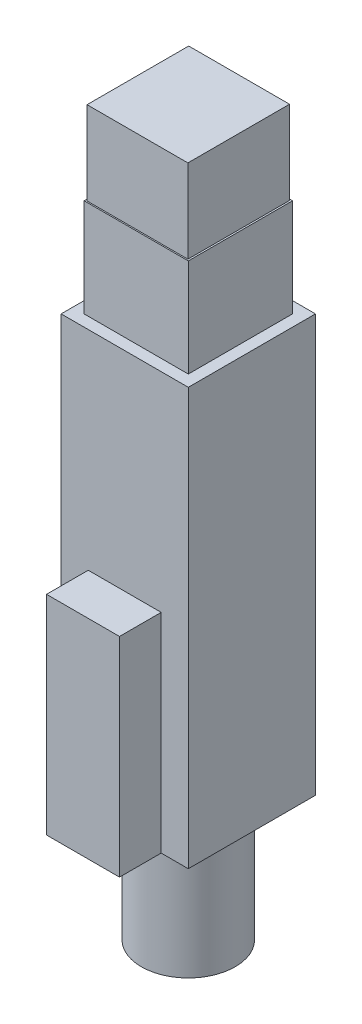
ISO-10303-21;
HEADER;
FILE_DESCRIPTION(('STEP AP214'),'2;1');
FILE_NAME('part.step','',(''),(''),'','','');
FILE_SCHEMA(('AUTOMOTIVE_DESIGN { 1 0 10303 214 1 1 1 1 }'));
ENDSEC;
DATA;
#1=APPLICATION_CONTEXT('core data for automotive mechanical design processes');
#2=APPLICATION_PROTOCOL_DEFINITION('international standard','automotive_design',2000,#1);
#3=PRODUCT_CONTEXT('',#1,'mechanical');
#4=PRODUCT('Part','Part','',(#3));
#5=PRODUCT_RELATED_PRODUCT_CATEGORY('part','',(#4));
#6=PRODUCT_DEFINITION_FORMATION('','',#4);
#7=PRODUCT_DEFINITION_CONTEXT('part definition',#1,'design');
#8=PRODUCT_DEFINITION('design','',#6,#7);
#9=PRODUCT_DEFINITION_SHAPE('','',#8);
#10=(LENGTH_UNIT() NAMED_UNIT(*) SI_UNIT(.MILLI.,.METRE.));
#11=(NAMED_UNIT(*) PLANE_ANGLE_UNIT() SI_UNIT($,.RADIAN.));
#12=(NAMED_UNIT(*) SI_UNIT($,.STERADIAN.) SOLID_ANGLE_UNIT());
#13=UNCERTAINTY_MEASURE_WITH_UNIT(LENGTH_MEASURE(1.E-05),#10,'distance_accuracy_value','');
#14=(GEOMETRIC_REPRESENTATION_CONTEXT(3) GLOBAL_UNCERTAINTY_ASSIGNED_CONTEXT((#13)) GLOBAL_UNIT_ASSIGNED_CONTEXT((#10,
#11,#12)) REPRESENTATION_CONTEXT('',''));
#15=CARTESIAN_POINT('',(0.,0.,0.));
#16=DIRECTION('',(0.,0.,1.));
#17=DIRECTION('',(1.,0.,0.));
#18=AXIS2_PLACEMENT_3D('',#15,#16,#17);
#19=CARTESIAN_POINT('',(-3.05,26.,3.05));
#20=DIRECTION('',(0.,0.,-1.));
#21=DIRECTION('',(-1.,0.,0.));
#22=AXIS2_PLACEMENT_3D('',#19,#20,#21);
#23=PLANE('',#22);
#24=DIRECTION('',(0.,-1.,0.));
#25=VECTOR('',#24,1.);
#26=CARTESIAN_POINT('',(-1.75,6.,3.05));
#27=LINE('',#26,#25);
#28=CARTESIAN_POINT('',(-1.75,16.,3.05));
#29=VERTEX_POINT('',#28);
#30=CARTESIAN_POINT('',(-1.75,6.,3.05));
#31=VERTEX_POINT('',#30);
#32=EDGE_CURVE('E38',#29,#31,#27,.T.);
#33=ORIENTED_EDGE('',*,*,#32,.F.);
#34=DIRECTION('',(-1.,0.,0.));
#35=VECTOR('',#34,1.);
#36=CARTESIAN_POINT('',(-1.75,16.,3.05));
#37=LINE('',#36,#35);
#38=CARTESIAN_POINT('',(1.75,16.,3.05));
#39=VERTEX_POINT('',#38);
#40=EDGE_CURVE('E169',#39,#29,#37,.T.);
#41=ORIENTED_EDGE('',*,*,#40,.F.);
#42=DIRECTION('',(0.,1.,0.));
#43=VECTOR('',#42,1.);
#44=CARTESIAN_POINT('',(1.75,6.,3.05));
#45=LINE('',#44,#43);
#46=CARTESIAN_POINT('',(1.75,6.,3.05));
#47=VERTEX_POINT('',#46);
#48=EDGE_CURVE('E57',#47,#39,#45,.T.);
#49=ORIENTED_EDGE('',*,*,#48,.F.);
#50=DIRECTION('',(1.,0.,0.));
#51=VECTOR('',#50,1.);
#52=CARTESIAN_POINT('',(-3.05,6.,3.05));
#53=LINE('',#52,#51);
#54=CARTESIAN_POINT('',(3.05,6.,3.05));
#55=VERTEX_POINT('',#54);
#56=EDGE_CURVE('E186',#47,#55,#53,.T.);
#57=ORIENTED_EDGE('',*,*,#56,.T.);
#58=DIRECTION('',(0.,-1.,0.));
#59=VECTOR('',#58,1.);
#60=CARTESIAN_POINT('',(3.05,26.,3.05));
#61=LINE('',#60,#59);
#62=CARTESIAN_POINT('',(3.05,26.,3.05));
#63=VERTEX_POINT('',#62);
#64=EDGE_CURVE('E195',#63,#55,#61,.T.);
#65=ORIENTED_EDGE('',*,*,#64,.F.);
#66=DIRECTION('',(1.,0.,0.));
#67=VECTOR('',#66,1.);
#68=CARTESIAN_POINT('',(-3.05,26.,3.05));
#69=LINE('',#68,#67);
#70=CARTESIAN_POINT('',(-3.05,26.,3.05));
#71=VERTEX_POINT('',#70);
#72=EDGE_CURVE('E200',#71,#63,#69,.T.);
#73=ORIENTED_EDGE('',*,*,#72,.F.);
#74=DIRECTION('',(0.,-1.,0.));
#75=VECTOR('',#74,1.);
#76=CARTESIAN_POINT('',(-3.05,26.,3.05));
#77=LINE('',#76,#75);
#78=CARTESIAN_POINT('',(-3.05,6.,3.05));
#79=VERTEX_POINT('',#78);
#80=EDGE_CURVE('E199',#71,#79,#77,.T.);
#81=ORIENTED_EDGE('',*,*,#80,.T.);
#82=EDGE_CURVE('E189',#79,#31,#53,.T.);
#83=ORIENTED_EDGE('',*,*,#82,.T.);
#84=EDGE_LOOP('',(#33,#41,#49,#57,#65,#73,#81,#83));
#85=FACE_BOUND('',#84,.T.);
#86=ADVANCED_FACE('F34',(#85),#23,.F.);
#87=CARTESIAN_POINT('',(2.5,34.7,2.5));
#88=DIRECTION('',(-1.,0.,0.));
#89=DIRECTION('',(0.,0.,1.));
#90=AXIS2_PLACEMENT_3D('',#87,#88,#89);
#91=PLANE('',#90);
#92=DIRECTION('',(0.,0.,-1.));
#93=VECTOR('',#92,1.);
#94=CARTESIAN_POINT('',(2.5,30.7,2.5));
#95=LINE('',#94,#93);
#96=CARTESIAN_POINT('',(2.5,30.7,2.5));
#97=VERTEX_POINT('',#96);
#98=CARTESIAN_POINT('',(2.5,30.7,-2.5));
#99=VERTEX_POINT('',#98);
#100=EDGE_CURVE('E286',#97,#99,#95,.T.);
#101=ORIENTED_EDGE('',*,*,#100,.F.);
#102=DIRECTION('',(0.,-1.,0.));
#103=VECTOR('',#102,1.);
#104=CARTESIAN_POINT('',(2.5,34.7,2.5));
#105=LINE('',#104,#103);
#106=CARTESIAN_POINT('',(2.5,26.,2.5));
#107=VERTEX_POINT('',#106);
#108=EDGE_CURVE('E272',#97,#107,#105,.T.);
#109=ORIENTED_EDGE('',*,*,#108,.T.);
#110=DIRECTION('',(0.,0.,-1.));
#111=VECTOR('',#110,1.);
#112=CARTESIAN_POINT('',(2.5,26.,2.5));
#113=LINE('',#112,#111);
#114=CARTESIAN_POINT('',(2.5,26.,-2.5));
#115=VERTEX_POINT('',#114);
#116=EDGE_CURVE('E283',#107,#115,#113,.T.);
#117=ORIENTED_EDGE('',*,*,#116,.T.);
#118=DIRECTION('',(0.,-1.,0.));
#119=VECTOR('',#118,1.);
#120=CARTESIAN_POINT('',(2.5,34.7,-2.5));
#121=LINE('',#120,#119);
#122=EDGE_CURVE('E256',#99,#115,#121,.T.);
#123=ORIENTED_EDGE('',*,*,#122,.F.);
#124=EDGE_LOOP('',(#101,#109,#117,#123));
#125=FACE_BOUND('',#124,.T.);
#126=ADVANCED_FACE('F228',(#125),#91,.F.);
#127=CARTESIAN_POINT('',(-2.5,34.7,-2.5));
#128=DIRECTION('',(0.,0.,1.));
#129=DIRECTION('',(1.,0.,0.));
#130=AXIS2_PLACEMENT_3D('',#127,#128,#129);
#131=PLANE('',#130);
#132=DIRECTION('',(-1.,0.,0.));
#133=VECTOR('',#132,1.);
#134=CARTESIAN_POINT('',(-2.5,30.7,-2.5));
#135=LINE('',#134,#133);
#136=CARTESIAN_POINT('',(-2.5,30.7,-2.5));
#137=VERTEX_POINT('',#136);
#138=EDGE_CURVE('E288',#99,#137,#135,.T.);
#139=ORIENTED_EDGE('',*,*,#138,.F.);
#140=ORIENTED_EDGE('',*,*,#122,.T.);
#141=DIRECTION('',(-1.,0.,0.));
#142=VECTOR('',#141,1.);
#143=CARTESIAN_POINT('',(-2.5,26.,-2.5));
#144=LINE('',#143,#142);
#145=CARTESIAN_POINT('',(-2.5,26.,-2.5));
#146=VERTEX_POINT('',#145);
#147=EDGE_CURVE('E280',#115,#146,#144,.T.);
#148=ORIENTED_EDGE('',*,*,#147,.T.);
#149=DIRECTION('',(0.,-1.,0.));
#150=VECTOR('',#149,1.);
#151=CARTESIAN_POINT('',(-2.5,34.7,-2.5));
#152=LINE('',#151,#150);
#153=EDGE_CURVE('E258',#137,#146,#152,.T.);
#154=ORIENTED_EDGE('',*,*,#153,.F.);
#155=EDGE_LOOP('',(#139,#140,#148,#154));
#156=FACE_BOUND('',#155,.T.);
#157=ADVANCED_FACE('F233',(#156),#131,.F.);
#158=CARTESIAN_POINT('',(-2.5,34.7,2.5));
#159=DIRECTION('',(1.,0.,0.));
#160=DIRECTION('',(0.,0.,-1.));
#161=AXIS2_PLACEMENT_3D('',#158,#159,#160);
#162=PLANE('',#161);
#163=DIRECTION('',(0.,0.,1.));
#164=VECTOR('',#163,1.);
#165=CARTESIAN_POINT('',(-2.5,30.7,2.5));
#166=LINE('',#165,#164);
#167=CARTESIAN_POINT('',(-2.5,30.7,2.5));
#168=VERTEX_POINT('',#167);
#169=EDGE_CURVE('E290',#137,#168,#166,.T.);
#170=ORIENTED_EDGE('',*,*,#169,.F.);
#171=ORIENTED_EDGE('',*,*,#153,.T.);
#172=DIRECTION('',(0.,0.,1.));
#173=VECTOR('',#172,1.);
#174=CARTESIAN_POINT('',(-2.5,26.,2.5));
#175=LINE('',#174,#173);
#176=CARTESIAN_POINT('',(-2.5,26.,2.5));
#177=VERTEX_POINT('',#176);
#178=EDGE_CURVE('E277',#146,#177,#175,.T.);
#179=ORIENTED_EDGE('',*,*,#178,.T.);
#180=DIRECTION('',(0.,-1.,0.));
#181=VECTOR('',#180,1.);
#182=CARTESIAN_POINT('',(-2.5,34.7,2.5));
#183=LINE('',#182,#181);
#184=EDGE_CURVE('E270',#168,#177,#183,.T.);
#185=ORIENTED_EDGE('',*,*,#184,.F.);
#186=EDGE_LOOP('',(#170,#171,#179,#185));
#187=FACE_BOUND('',#186,.T.);
#188=ADVANCED_FACE('F370',(#187),#162,.F.);
#189=CARTESIAN_POINT('',(-2.5,34.7,2.5));
#190=DIRECTION('',(0.,0.,-1.));
#191=DIRECTION('',(-1.,0.,0.));
#192=AXIS2_PLACEMENT_3D('',#189,#190,#191);
#193=PLANE('',#192);
#194=DIRECTION('',(1.,0.,0.));
#195=VECTOR('',#194,1.);
#196=CARTESIAN_POINT('',(-2.5,30.7,2.5));
#197=LINE('',#196,#195);
#198=EDGE_CURVE('E12',#168,#97,#197,.T.);
#199=ORIENTED_EDGE('',*,*,#198,.F.);
#200=ORIENTED_EDGE('',*,*,#184,.T.);
#201=DIRECTION('',(1.,0.,0.));
#202=VECTOR('',#201,1.);
#203=CARTESIAN_POINT('',(-2.5,26.,2.5));
#204=LINE('',#203,#202);
#205=EDGE_CURVE('E274',#177,#107,#204,.T.);
#206=ORIENTED_EDGE('',*,*,#205,.T.);
#207=ORIENTED_EDGE('',*,*,#108,.F.);
#208=EDGE_LOOP('',(#199,#200,#206,#207));
#209=FACE_BOUND('',#208,.T.);
#210=ADVANCED_FACE('F367',(#209),#193,.F.);
#211=CARTESIAN_POINT('',(0.,26.,0.));
#212=DIRECTION('',(0.,-1.,0.));
#213=DIRECTION('',(0.,0.,-1.));
#214=AXIS2_PLACEMENT_3D('',#211,#212,#213);
#215=PLANE('',#214);
#216=DIRECTION('',(0.,0.,-1.));
#217=VECTOR('',#216,1.);
#218=CARTESIAN_POINT('',(3.05,26.,3.05));
#219=LINE('',#218,#217);
#220=CARTESIAN_POINT('',(3.05,26.,-3.05));
#221=VERTEX_POINT('',#220);
#222=EDGE_CURVE('E266',#63,#221,#219,.T.);
#223=ORIENTED_EDGE('',*,*,#222,.T.);
#224=DIRECTION('',(-1.,0.,0.));
#225=VECTOR('',#224,1.);
#226=CARTESIAN_POINT('',(-3.05,26.,-3.05));
#227=LINE('',#226,#225);
#228=CARTESIAN_POINT('',(-3.05,26.,-3.05));
#229=VERTEX_POINT('',#228);
#230=EDGE_CURVE('E264',#221,#229,#227,.T.);
#231=ORIENTED_EDGE('',*,*,#230,.T.);
#232=DIRECTION('',(0.,0.,1.));
#233=VECTOR('',#232,1.);
#234=CARTESIAN_POINT('',(-3.05,26.,3.05));
#235=LINE('',#234,#233);
#236=EDGE_CURVE('E262',#229,#71,#235,.T.);
#237=ORIENTED_EDGE('',*,*,#236,.T.);
#238=ORIENTED_EDGE('',*,*,#72,.T.);
#239=EDGE_LOOP('',(#223,#231,#237,#238));
#240=FACE_BOUND('',#239,.T.);
#241=ORIENTED_EDGE('',*,*,#116,.F.);
#242=ORIENTED_EDGE('',*,*,#205,.F.);
#243=ORIENTED_EDGE('',*,*,#178,.F.);
#244=ORIENTED_EDGE('',*,*,#147,.F.);
#245=EDGE_LOOP('',(#241,#242,#243,#244));
#246=FACE_BOUND('',#245,.T.);
#247=ADVANCED_FACE('F224',(#240,#246),#215,.F.);
#248=CARTESIAN_POINT('',(0.,6.,0.));
#249=DIRECTION('',(0.,-1.,0.));
#250=DIRECTION('',(0.,0.,-1.));
#251=AXIS2_PLACEMENT_3D('',#248,#249,#250);
#252=CYLINDRICAL_SURFACE('',#251,2.25);
#253=CARTESIAN_POINT('',(0.,6.,0.));
#254=DIRECTION('',(0.,1.,0.));
#255=DIRECTION('',(0.,0.,1.));
#256=AXIS2_PLACEMENT_3D('',#253,#254,#255);
#257=CIRCLE('',#256,2.25);
#258=CARTESIAN_POINT('',(0.,6.,2.25));
#259=VERTEX_POINT('',#258);
#260=EDGE_CURVE('E44',#259,#259,#257,.T.);
#261=ORIENTED_EDGE('',*,*,#260,.F.);
#262=EDGE_LOOP('',(#261));
#263=FACE_BOUND('',#262,.T.);
#264=CARTESIAN_POINT('',(0.,0.,0.));
#265=DIRECTION('',(0.,1.,0.));
#266=DIRECTION('',(0.,0.,1.));
#267=AXIS2_PLACEMENT_3D('',#264,#265,#266);
#268=CIRCLE('',#267,2.25);
#269=CARTESIAN_POINT('',(0.,0.,2.25));
#270=VERTEX_POINT('',#269);
#271=EDGE_CURVE('E209',#270,#270,#268,.T.);
#272=ORIENTED_EDGE('',*,*,#271,.T.);
#273=EDGE_LOOP('',(#272));
#274=FACE_BOUND('',#273,.T.);
#275=ADVANCED_FACE('F36',(#263,#274),#252,.T.);
#276=CARTESIAN_POINT('',(0.,0.,0.));
#277=DIRECTION('',(0.,1.,0.));
#278=DIRECTION('',(0.,0.,1.));
#279=AXIS2_PLACEMENT_3D('',#276,#277,#278);
#280=PLANE('',#279);
#281=ORIENTED_EDGE('',*,*,#271,.F.);
#282=EDGE_LOOP('',(#281));
#283=FACE_BOUND('',#282,.T.);
#284=ADVANCED_FACE('F216',(#283),#280,.F.);
#285=CARTESIAN_POINT('',(0.,6.,0.));
#286=DIRECTION('',(0.,-1.,0.));
#287=DIRECTION('',(0.,0.,-1.));
#288=AXIS2_PLACEMENT_3D('',#285,#286,#287);
#289=PLANE('',#288);
#290=DIRECTION('',(0.,0.,-1.));
#291=VECTOR('',#290,1.);
#292=CARTESIAN_POINT('',(3.05,6.,3.05));
#293=LINE('',#292,#291);
#294=CARTESIAN_POINT('',(3.05,6.,-3.05));
#295=VERTEX_POINT('',#294);
#296=EDGE_CURVE('E252',#55,#295,#293,.T.);
#297=ORIENTED_EDGE('',*,*,#296,.F.);
#298=ORIENTED_EDGE('',*,*,#56,.F.);
#299=DIRECTION('',(0.,0.,-1.));
#300=VECTOR('',#299,1.);
#301=CARTESIAN_POINT('',(1.75,6.,5.05));
#302=LINE('',#301,#300);
#303=CARTESIAN_POINT('',(1.75,6.,5.05));
#304=VERTEX_POINT('',#303);
#305=EDGE_CURVE('E156',#304,#47,#302,.T.);
#306=ORIENTED_EDGE('',*,*,#305,.F.);
#307=DIRECTION('',(1.,0.,0.));
#308=VECTOR('',#307,1.);
#309=CARTESIAN_POINT('',(-1.75,6.,5.05));
#310=LINE('',#309,#308);
#311=CARTESIAN_POINT('',(-1.75,6.,5.05));
#312=VERTEX_POINT('',#311);
#313=EDGE_CURVE('E147',#312,#304,#310,.T.);
#314=ORIENTED_EDGE('',*,*,#313,.F.);
#315=DIRECTION('',(0.,0.,-1.));
#316=VECTOR('',#315,1.);
#317=CARTESIAN_POINT('',(-1.75,6.,5.05));
#318=LINE('',#317,#316);
#319=EDGE_CURVE('E154',#312,#31,#318,.T.);
#320=ORIENTED_EDGE('',*,*,#319,.T.);
#321=ORIENTED_EDGE('',*,*,#82,.F.);
#322=DIRECTION('',(0.,0.,1.));
#323=VECTOR('',#322,1.);
#324=CARTESIAN_POINT('',(-3.05,6.,3.05));
#325=LINE('',#324,#323);
#326=CARTESIAN_POINT('',(-3.05,6.,-3.05));
#327=VERTEX_POINT('',#326);
#328=EDGE_CURVE('E190',#327,#79,#325,.T.);
#329=ORIENTED_EDGE('',*,*,#328,.F.);
#330=DIRECTION('',(-1.,0.,0.));
#331=VECTOR('',#330,1.);
#332=CARTESIAN_POINT('',(-3.05,6.,-3.05));
#333=LINE('',#332,#331);
#334=EDGE_CURVE('E255',#295,#327,#333,.T.);
#335=ORIENTED_EDGE('',*,*,#334,.F.);
#336=EDGE_LOOP('',(#297,#298,#306,#314,#320,#321,#329,#335));
#337=FACE_BOUND('',#336,.T.);
#338=ORIENTED_EDGE('',*,*,#260,.T.);
#339=EDGE_LOOP('',(#338));
#340=FACE_BOUND('',#339,.T.);
#341=ADVANCED_FACE('F150',(#337,#340),#289,.T.);
#342=CARTESIAN_POINT('',(3.05,26.,3.05));
#343=DIRECTION('',(-1.,0.,0.));
#344=DIRECTION('',(0.,0.,1.));
#345=AXIS2_PLACEMENT_3D('',#342,#343,#344);
#346=PLANE('',#345);
#347=ORIENTED_EDGE('',*,*,#296,.T.);
#348=DIRECTION('',(0.,-1.,0.));
#349=VECTOR('',#348,1.);
#350=CARTESIAN_POINT('',(3.05,26.,-3.05));
#351=LINE('',#350,#349);
#352=EDGE_CURVE('E206',#221,#295,#351,.T.);
#353=ORIENTED_EDGE('',*,*,#352,.F.);
#354=ORIENTED_EDGE('',*,*,#222,.F.);
#355=ORIENTED_EDGE('',*,*,#64,.T.);
#356=EDGE_LOOP('',(#347,#353,#354,#355));
#357=FACE_BOUND('',#356,.T.);
#358=ADVANCED_FACE('F222',(#357),#346,.F.);
#359=CARTESIAN_POINT('',(-3.05,26.,-3.05));
#360=DIRECTION('',(0.,0.,1.));
#361=DIRECTION('',(1.,0.,0.));
#362=AXIS2_PLACEMENT_3D('',#359,#360,#361);
#363=PLANE('',#362);
#364=ORIENTED_EDGE('',*,*,#334,.T.);
#365=DIRECTION('',(0.,-1.,0.));
#366=VECTOR('',#365,1.);
#367=CARTESIAN_POINT('',(-3.05,26.,-3.05));
#368=LINE('',#367,#366);
#369=EDGE_CURVE('E203',#229,#327,#368,.T.);
#370=ORIENTED_EDGE('',*,*,#369,.F.);
#371=ORIENTED_EDGE('',*,*,#230,.F.);
#372=ORIENTED_EDGE('',*,*,#352,.T.);
#373=EDGE_LOOP('',(#364,#370,#371,#372));
#374=FACE_BOUND('',#373,.T.);
#375=ADVANCED_FACE('F242',(#374),#363,.F.);
#376=CARTESIAN_POINT('',(-3.05,26.,3.05));
#377=DIRECTION('',(1.,0.,0.));
#378=DIRECTION('',(0.,0.,-1.));
#379=AXIS2_PLACEMENT_3D('',#376,#377,#378);
#380=PLANE('',#379);
#381=ORIENTED_EDGE('',*,*,#328,.T.);
#382=ORIENTED_EDGE('',*,*,#80,.F.);
#383=ORIENTED_EDGE('',*,*,#236,.F.);
#384=ORIENTED_EDGE('',*,*,#369,.T.);
#385=EDGE_LOOP('',(#381,#382,#383,#384));
#386=FACE_BOUND('',#385,.T.);
#387=ADVANCED_FACE('F238',(#386),#380,.F.);
#388=CARTESIAN_POINT('',(0.,30.7,0.));
#389=DIRECTION('',(0.,1.,0.));
#390=DIRECTION('',(0.,0.,1.));
#391=AXIS2_PLACEMENT_3D('',#388,#389,#390);
#392=PLANE('',#391);
#393=DIRECTION('',(1.,0.,0.));
#394=VECTOR('',#393,1.);
#395=CARTESIAN_POINT('',(-2.41818934805159,30.7,2.43809946343759));
#396=LINE('',#395,#394);
#397=CARTESIAN_POINT('',(-2.41818934805159,30.7,2.43809946343759));
#398=VERTEX_POINT('',#397);
#399=CARTESIAN_POINT('',(2.41818934805159,30.7,2.43809946343759));
#400=VERTEX_POINT('',#399);
#401=EDGE_CURVE('E296',#398,#400,#396,.T.);
#402=ORIENTED_EDGE('',*,*,#401,.F.);
#403=DIRECTION('',(0.,0.,1.));
#404=VECTOR('',#403,1.);
#405=CARTESIAN_POINT('',(-2.41818934805159,30.7,2.43809946343759));
#406=LINE('',#405,#404);
#407=CARTESIAN_POINT('',(-2.41818934805159,30.7,-2.43809946343759));
#408=VERTEX_POINT('',#407);
#409=EDGE_CURVE('E313',#408,#398,#406,.T.);
#410=ORIENTED_EDGE('',*,*,#409,.F.);
#411=DIRECTION('',(-1.,0.,0.));
#412=VECTOR('',#411,1.);
#413=CARTESIAN_POINT('',(-2.41818934805159,30.7,-2.43809946343759));
#414=LINE('',#413,#412);
#415=CARTESIAN_POINT('',(2.41818934805159,30.7,-2.43809946343759));
#416=VERTEX_POINT('',#415);
#417=EDGE_CURVE('E316',#416,#408,#414,.T.);
#418=ORIENTED_EDGE('',*,*,#417,.F.);
#419=DIRECTION('',(0.,0.,-1.));
#420=VECTOR('',#419,1.);
#421=CARTESIAN_POINT('',(2.41818934805159,30.7,2.43809946343759));
#422=LINE('',#421,#420);
#423=EDGE_CURVE('E305',#400,#416,#422,.T.);
#424=ORIENTED_EDGE('',*,*,#423,.F.);
#425=EDGE_LOOP('',(#402,#410,#418,#424));
#426=FACE_BOUND('',#425,.T.);
#427=ORIENTED_EDGE('',*,*,#100,.T.);
#428=ORIENTED_EDGE('',*,*,#138,.T.);
#429=ORIENTED_EDGE('',*,*,#169,.T.);
#430=ORIENTED_EDGE('',*,*,#198,.T.);
#431=EDGE_LOOP('',(#427,#428,#429,#430));
#432=FACE_BOUND('',#431,.T.);
#433=ADVANCED_FACE('F241',(#426,#432),#392,.T.);
#434=CARTESIAN_POINT('',(2.41818934805159,30.7,2.43809946343759));
#435=DIRECTION('',(1.,0.,0.));
#436=DIRECTION('',(0.,0.,-1.));
#437=AXIS2_PLACEMENT_3D('',#434,#435,#436);
#438=PLANE('',#437);
#439=DIRECTION('',(0.,0.,-1.));
#440=VECTOR('',#439,1.);
#441=CARTESIAN_POINT('',(2.41818934805159,34.7,2.43809946343759));
#442=LINE('',#441,#440);
#443=CARTESIAN_POINT('',(2.41818934805159,34.7,2.43809946343759));
#444=VERTEX_POINT('',#443);
#445=CARTESIAN_POINT('',(2.41818934805159,34.7,-2.43809946343759));
#446=VERTEX_POINT('',#445);
#447=EDGE_CURVE('E172',#444,#446,#442,.T.);
#448=ORIENTED_EDGE('',*,*,#447,.F.);
#449=DIRECTION('',(0.,1.,0.));
#450=VECTOR('',#449,1.);
#451=CARTESIAN_POINT('',(2.41818934805159,30.7,2.43809946343759));
#452=LINE('',#451,#450);
#453=EDGE_CURVE('E292',#400,#444,#452,.T.);
#454=ORIENTED_EDGE('',*,*,#453,.F.);
#455=ORIENTED_EDGE('',*,*,#423,.T.);
#456=DIRECTION('',(0.,1.,0.));
#457=VECTOR('',#456,1.);
#458=CARTESIAN_POINT('',(2.41818934805159,30.7,-2.43809946343759));
#459=LINE('',#458,#457);
#460=EDGE_CURVE('E293',#416,#446,#459,.T.);
#461=ORIENTED_EDGE('',*,*,#460,.T.);
#462=EDGE_LOOP('',(#448,#454,#455,#461));
#463=FACE_BOUND('',#462,.T.);
#464=ADVANCED_FACE('F349',(#463),#438,.T.);
#465=CARTESIAN_POINT('',(-2.41818934805159,30.7,2.43809946343759));
#466=DIRECTION('',(0.,0.,1.));
#467=DIRECTION('',(1.,0.,0.));
#468=AXIS2_PLACEMENT_3D('',#465,#466,#467);
#469=PLANE('',#468);
#470=DIRECTION('',(1.,0.,0.));
#471=VECTOR('',#470,1.);
#472=CARTESIAN_POINT('',(-2.41818934805159,34.7,2.43809946343759));
#473=LINE('',#472,#471);
#474=CARTESIAN_POINT('',(-2.41818934805159,34.7,2.43809946343759));
#475=VERTEX_POINT('',#474);
#476=EDGE_CURVE('E302',#475,#444,#473,.T.);
#477=ORIENTED_EDGE('',*,*,#476,.F.);
#478=DIRECTION('',(0.,1.,0.));
#479=VECTOR('',#478,1.);
#480=CARTESIAN_POINT('',(-2.41818934805159,30.7,2.43809946343759));
#481=LINE('',#480,#479);
#482=EDGE_CURVE('E299',#398,#475,#481,.T.);
#483=ORIENTED_EDGE('',*,*,#482,.F.);
#484=ORIENTED_EDGE('',*,*,#401,.T.);
#485=ORIENTED_EDGE('',*,*,#453,.T.);
#486=EDGE_LOOP('',(#477,#483,#484,#485));
#487=FACE_BOUND('',#486,.T.);
#488=ADVANCED_FACE('F345',(#487),#469,.T.);
#489=CARTESIAN_POINT('',(-2.41818934805159,30.7,2.43809946343759));
#490=DIRECTION('',(-1.,0.,0.));
#491=DIRECTION('',(0.,0.,1.));
#492=AXIS2_PLACEMENT_3D('',#489,#490,#491);
#493=PLANE('',#492);
#494=DIRECTION('',(0.,0.,1.));
#495=VECTOR('',#494,1.);
#496=CARTESIAN_POINT('',(-2.41818934805159,34.7,2.43809946343759));
#497=LINE('',#496,#495);
#498=CARTESIAN_POINT('',(-2.41818934805159,34.7,-2.43809946343759));
#499=VERTEX_POINT('',#498);
#500=EDGE_CURVE('E306',#499,#475,#497,.T.);
#501=ORIENTED_EDGE('',*,*,#500,.F.);
#502=DIRECTION('',(0.,1.,0.));
#503=VECTOR('',#502,1.);
#504=CARTESIAN_POINT('',(-2.41818934805159,30.7,-2.43809946343759));
#505=LINE('',#504,#503);
#506=EDGE_CURVE('E295',#408,#499,#505,.T.);
#507=ORIENTED_EDGE('',*,*,#506,.F.);
#508=ORIENTED_EDGE('',*,*,#409,.T.);
#509=ORIENTED_EDGE('',*,*,#482,.T.);
#510=EDGE_LOOP('',(#501,#507,#508,#509));
#511=FACE_BOUND('',#510,.T.);
#512=ADVANCED_FACE('F348',(#511),#493,.T.);
#513=CARTESIAN_POINT('',(-2.41818934805159,30.7,-2.43809946343759));
#514=DIRECTION('',(0.,0.,-1.));
#515=DIRECTION('',(-1.,0.,0.));
#516=AXIS2_PLACEMENT_3D('',#513,#514,#515);
#517=PLANE('',#516);
#518=DIRECTION('',(-1.,0.,0.));
#519=VECTOR('',#518,1.);
#520=CARTESIAN_POINT('',(-2.41818934805159,34.7,-2.43809946343759));
#521=LINE('',#520,#519);
#522=EDGE_CURVE('E175',#446,#499,#521,.T.);
#523=ORIENTED_EDGE('',*,*,#522,.F.);
#524=ORIENTED_EDGE('',*,*,#460,.F.);
#525=ORIENTED_EDGE('',*,*,#417,.T.);
#526=ORIENTED_EDGE('',*,*,#506,.T.);
#527=EDGE_LOOP('',(#523,#524,#525,#526));
#528=FACE_BOUND('',#527,.T.);
#529=ADVANCED_FACE('F353',(#528),#517,.T.);
#530=CARTESIAN_POINT('',(0.,34.7,0.));
#531=DIRECTION('',(0.,-1.,0.));
#532=DIRECTION('',(0.,0.,-1.));
#533=AXIS2_PLACEMENT_3D('',#530,#531,#532);
#534=PLANE('',#533);
#535=ORIENTED_EDGE('',*,*,#447,.T.);
#536=ORIENTED_EDGE('',*,*,#522,.T.);
#537=ORIENTED_EDGE('',*,*,#500,.T.);
#538=ORIENTED_EDGE('',*,*,#476,.T.);
#539=EDGE_LOOP('',(#535,#536,#537,#538));
#540=FACE_BOUND('',#539,.T.);
#541=ADVANCED_FACE('F344',(#540),#534,.F.);
#542=CARTESIAN_POINT('',(-1.75,6.,5.05));
#543=DIRECTION('',(1.,0.,0.));
#544=DIRECTION('',(0.,0.,-1.));
#545=AXIS2_PLACEMENT_3D('',#542,#543,#544);
#546=PLANE('',#545);
#547=ORIENTED_EDGE('',*,*,#32,.T.);
#548=ORIENTED_EDGE('',*,*,#319,.F.);
#549=DIRECTION('',(0.,-1.,0.));
#550=VECTOR('',#549,1.);
#551=CARTESIAN_POINT('',(-1.75,6.,5.05));
#552=LINE('',#551,#550);
#553=CARTESIAN_POINT('',(-1.75,16.,5.05));
#554=VERTEX_POINT('',#553);
#555=EDGE_CURVE('E160',#554,#312,#552,.T.);
#556=ORIENTED_EDGE('',*,*,#555,.F.);
#557=DIRECTION('',(0.,0.,-1.));
#558=VECTOR('',#557,1.);
#559=CARTESIAN_POINT('',(-1.75,16.,5.05));
#560=LINE('',#559,#558);
#561=EDGE_CURVE('E323',#554,#29,#560,.T.);
#562=ORIENTED_EDGE('',*,*,#561,.T.);
#563=EDGE_LOOP('',(#547,#548,#556,#562));
#564=FACE_BOUND('',#563,.T.);
#565=ADVANCED_FACE('F171',(#564),#546,.F.);
#566=CARTESIAN_POINT('',(1.75,6.,5.05));
#567=DIRECTION('',(-1.,0.,0.));
#568=DIRECTION('',(0.,0.,1.));
#569=AXIS2_PLACEMENT_3D('',#566,#567,#568);
#570=PLANE('',#569);
#571=ORIENTED_EDGE('',*,*,#48,.T.);
#572=DIRECTION('',(0.,0.,-1.));
#573=VECTOR('',#572,1.);
#574=CARTESIAN_POINT('',(1.75,16.,5.05));
#575=LINE('',#574,#573);
#576=CARTESIAN_POINT('',(1.75,16.,5.05));
#577=VERTEX_POINT('',#576);
#578=EDGE_CURVE('E177',#577,#39,#575,.T.);
#579=ORIENTED_EDGE('',*,*,#578,.F.);
#580=DIRECTION('',(0.,1.,0.));
#581=VECTOR('',#580,1.);
#582=CARTESIAN_POINT('',(1.75,6.,5.05));
#583=LINE('',#582,#581);
#584=EDGE_CURVE('E159',#304,#577,#583,.T.);
#585=ORIENTED_EDGE('',*,*,#584,.F.);
#586=ORIENTED_EDGE('',*,*,#305,.T.);
#587=EDGE_LOOP('',(#571,#579,#585,#586));
#588=FACE_BOUND('',#587,.T.);
#589=ADVANCED_FACE('F330',(#588),#570,.F.);
#590=CARTESIAN_POINT('',(-1.75,16.,5.05));
#591=DIRECTION('',(0.,-1.,0.));
#592=DIRECTION('',(0.,0.,-1.));
#593=AXIS2_PLACEMENT_3D('',#590,#591,#592);
#594=PLANE('',#593);
#595=ORIENTED_EDGE('',*,*,#40,.T.);
#596=ORIENTED_EDGE('',*,*,#561,.F.);
#597=DIRECTION('',(-1.,0.,0.));
#598=VECTOR('',#597,1.);
#599=CARTESIAN_POINT('',(-1.75,16.,5.05));
#600=LINE('',#599,#598);
#601=EDGE_CURVE('E165',#577,#554,#600,.T.);
#602=ORIENTED_EDGE('',*,*,#601,.F.);
#603=ORIENTED_EDGE('',*,*,#578,.T.);
#604=EDGE_LOOP('',(#595,#596,#602,#603));
#605=FACE_BOUND('',#604,.T.);
#606=ADVANCED_FACE('F332',(#605),#594,.F.);
#607=CARTESIAN_POINT('',(0.,0.,5.05));
#608=DIRECTION('',(0.,0.,-1.));
#609=DIRECTION('',(-1.,0.,0.));
#610=AXIS2_PLACEMENT_3D('',#607,#608,#609);
#611=PLANE('',#610);
#612=ORIENTED_EDGE('',*,*,#555,.T.);
#613=ORIENTED_EDGE('',*,*,#313,.T.);
#614=ORIENTED_EDGE('',*,*,#584,.T.);
#615=ORIENTED_EDGE('',*,*,#601,.T.);
#616=EDGE_LOOP('',(#612,#613,#614,#615));
#617=FACE_BOUND('',#616,.T.);
#618=ADVANCED_FACE('F163',(#617),#611,.F.);
#619=CLOSED_SHELL('',(#86,#126,#157,#188,#210,#247,#275,#284,#341,#358,#375,#387,#433,#464,#488,
#512,#529,#541,#565,#589,#606,#618));
#620=MANIFOLD_SOLID_BREP('B2',#619);
#621=ADVANCED_BREP_SHAPE_REPRESENTATION('',(#18,#620),#14);
#622=SHAPE_DEFINITION_REPRESENTATION(#9,#621);
ENDSEC;
END-ISO-10303-21;
